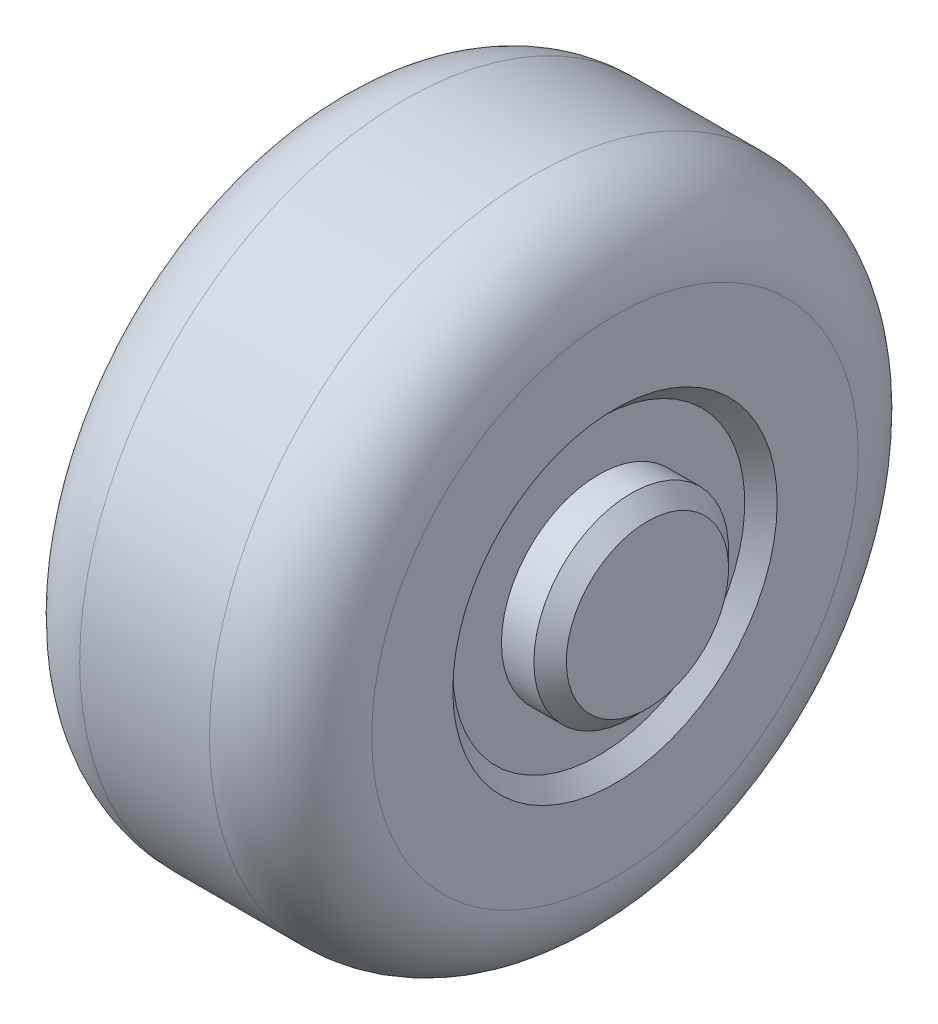
ISO-10303-21;
HEADER;
FILE_DESCRIPTION(('STEP AP214'),'2;1');
FILE_NAME('part.step','',(''),(''),'','','');
FILE_SCHEMA(('AUTOMOTIVE_DESIGN { 1 0 10303 214 1 1 1 1 }'));
ENDSEC;
DATA;
#1=APPLICATION_CONTEXT('core data for automotive mechanical design processes');
#2=APPLICATION_PROTOCOL_DEFINITION('international standard','automotive_design',2000,#1);
#3=PRODUCT_CONTEXT('',#1,'mechanical');
#4=PRODUCT('Part','Part','',(#3));
#5=PRODUCT_RELATED_PRODUCT_CATEGORY('part','',(#4));
#6=PRODUCT_DEFINITION_FORMATION('','',#4);
#7=PRODUCT_DEFINITION_CONTEXT('part definition',#1,'design');
#8=PRODUCT_DEFINITION('design','',#6,#7);
#9=PRODUCT_DEFINITION_SHAPE('','',#8);
#10=(LENGTH_UNIT() NAMED_UNIT(*) SI_UNIT(.MILLI.,.METRE.));
#11=(NAMED_UNIT(*) PLANE_ANGLE_UNIT() SI_UNIT($,.RADIAN.));
#12=(NAMED_UNIT(*) SI_UNIT($,.STERADIAN.) SOLID_ANGLE_UNIT());
#13=UNCERTAINTY_MEASURE_WITH_UNIT(LENGTH_MEASURE(1.E-05),#10,'distance_accuracy_value','');
#14=(GEOMETRIC_REPRESENTATION_CONTEXT(3) GLOBAL_UNCERTAINTY_ASSIGNED_CONTEXT((#13)) GLOBAL_UNIT_ASSIGNED_CONTEXT((#10,
#11,#12)) REPRESENTATION_CONTEXT('',''));
#15=CARTESIAN_POINT('',(0.,0.,0.));
#16=DIRECTION('',(0.,0.,1.));
#17=DIRECTION('',(1.,0.,0.));
#18=AXIS2_PLACEMENT_3D('',#15,#16,#17);
#19=CARTESIAN_POINT('',(-11.,0.,0.));
#20=DIRECTION('',(1.,0.,0.));
#21=DIRECTION('',(0.,0.,-1.));
#22=AXIS2_PLACEMENT_3D('',#19,#20,#21);
#23=PLANE('',#22);
#24=CARTESIAN_POINT('',(-11.,0.,0.));
#25=DIRECTION('',(-1.,0.,0.));
#26=DIRECTION('',(0.,0.,1.));
#27=AXIS2_PLACEMENT_3D('',#24,#25,#26);
#28=CIRCLE('',#27,5.);
#29=CARTESIAN_POINT('',(-11.,0.,5.));
#30=VERTEX_POINT('',#29);
#31=EDGE_CURVE('E10',#30,#30,#28,.T.);
#32=ORIENTED_EDGE('',*,*,#31,.T.);
#33=EDGE_LOOP('',(#32));
#34=FACE_BOUND('',#33,.T.);
#35=ADVANCED_FACE('F37',(#34),#23,.F.);
#36=CARTESIAN_POINT('',(-10.,0.,0.));
#37=DIRECTION('',(1.,0.,0.));
#38=DIRECTION('',(0.,0.,-1.));
#39=AXIS2_PLACEMENT_3D('',#36,#37,#38);
#40=CONICAL_SURFACE('',#39,6.,0.785398163397448);
#41=ORIENTED_EDGE('',*,*,#31,.F.);
#42=EDGE_LOOP('',(#41));
#43=FACE_BOUND('',#42,.T.);
#44=CARTESIAN_POINT('',(-10.,0.,0.));
#45=DIRECTION('',(-1.,0.,0.));
#46=DIRECTION('',(0.,0.,1.));
#47=AXIS2_PLACEMENT_3D('',#44,#45,#46);
#48=CIRCLE('',#47,6.);
#49=CARTESIAN_POINT('',(-10.,0.,6.));
#50=VERTEX_POINT('',#49);
#51=EDGE_CURVE('E43',#50,#50,#48,.T.);
#52=ORIENTED_EDGE('',*,*,#51,.T.);
#53=EDGE_LOOP('',(#52));
#54=FACE_BOUND('',#53,.T.);
#55=ADVANCED_FACE('F99',(#43,#54),#40,.T.);
#56=CARTESIAN_POINT('',(11.,0.,0.));
#57=DIRECTION('',(-1.,0.,0.));
#58=DIRECTION('',(0.,0.,1.));
#59=AXIS2_PLACEMENT_3D('',#56,#57,#58);
#60=CYLINDRICAL_SURFACE('',#59,6.);
#61=ORIENTED_EDGE('',*,*,#51,.F.);
#62=EDGE_LOOP('',(#61));
#63=FACE_BOUND('',#62,.T.);
#64=CARTESIAN_POINT('',(-8.,0.,0.));
#65=DIRECTION('',(-1.,0.,0.));
#66=DIRECTION('',(0.,0.,1.));
#67=AXIS2_PLACEMENT_3D('',#64,#65,#66);
#68=CIRCLE('',#67,6.);
#69=CARTESIAN_POINT('',(-8.,0.,6.));
#70=VERTEX_POINT('',#69);
#71=EDGE_CURVE('E47',#70,#70,#68,.T.);
#72=ORIENTED_EDGE('',*,*,#71,.T.);
#73=EDGE_LOOP('',(#72));
#74=FACE_BOUND('',#73,.T.);
#75=ADVANCED_FACE('F103',(#63,#74),#60,.T.);
#76=CARTESIAN_POINT('',(-8.,6.,0.));
#77=DIRECTION('',(1.,0.,0.));
#78=DIRECTION('',(0.,0.,-1.));
#79=AXIS2_PLACEMENT_3D('',#76,#77,#78);
#80=PLANE('',#79);
#81=ORIENTED_EDGE('',*,*,#71,.F.);
#82=EDGE_LOOP('',(#81));
#83=FACE_BOUND('',#82,.T.);
#84=CARTESIAN_POINT('',(-8.,0.,0.));
#85=DIRECTION('',(-1.,0.,0.));
#86=DIRECTION('',(0.,0.,1.));
#87=AXIS2_PLACEMENT_3D('',#84,#85,#86);
#88=CIRCLE('',#87,9.);
#89=CARTESIAN_POINT('',(-8.,0.,9.));
#90=VERTEX_POINT('',#89);
#91=EDGE_CURVE('E51',#90,#90,#88,.T.);
#92=ORIENTED_EDGE('',*,*,#91,.T.);
#93=EDGE_LOOP('',(#92));
#94=FACE_BOUND('',#93,.T.);
#95=ADVANCED_FACE('F108',(#83,#94),#80,.F.);
#96=CARTESIAN_POINT('',(-9.,0.,0.));
#97=DIRECTION('',(-1.,0.,0.));
#98=DIRECTION('',(0.,0.,1.));
#99=AXIS2_PLACEMENT_3D('',#96,#97,#98);
#100=CONICAL_SURFACE('',#99,10.,0.785398163397447);
#101=ORIENTED_EDGE('',*,*,#91,.F.);
#102=EDGE_LOOP('',(#101));
#103=FACE_BOUND('',#102,.T.);
#104=CARTESIAN_POINT('',(-9.,0.,0.));
#105=DIRECTION('',(-1.,0.,0.));
#106=DIRECTION('',(0.,0.,1.));
#107=AXIS2_PLACEMENT_3D('',#104,#105,#106);
#108=CIRCLE('',#107,10.);
#109=CARTESIAN_POINT('',(-9.,0.,10.));
#110=VERTEX_POINT('',#109);
#111=EDGE_CURVE('E56',#110,#110,#108,.T.);
#112=ORIENTED_EDGE('',*,*,#111,.T.);
#113=EDGE_LOOP('',(#112));
#114=FACE_BOUND('',#113,.T.);
#115=ADVANCED_FACE('F114',(#103,#114),#100,.F.);
#116=CARTESIAN_POINT('',(-9.,10.,0.));
#117=DIRECTION('',(1.,0.,0.));
#118=DIRECTION('',(0.,0.,-1.));
#119=AXIS2_PLACEMENT_3D('',#116,#117,#118);
#120=PLANE('',#119);
#121=ORIENTED_EDGE('',*,*,#111,.F.);
#122=EDGE_LOOP('',(#121));
#123=FACE_BOUND('',#122,.T.);
#124=CARTESIAN_POINT('',(-9.,0.,0.));
#125=DIRECTION('',(-1.,0.,0.));
#126=DIRECTION('',(0.,0.,1.));
#127=AXIS2_PLACEMENT_3D('',#124,#125,#126);
#128=CIRCLE('',#127,15.);
#129=CARTESIAN_POINT('',(-9.,0.,15.));
#130=VERTEX_POINT('',#129);
#131=EDGE_CURVE('E59',#130,#130,#128,.T.);
#132=ORIENTED_EDGE('',*,*,#131,.T.);
#133=EDGE_LOOP('',(#132));
#134=FACE_BOUND('',#133,.T.);
#135=ADVANCED_FACE('F118',(#123,#134),#120,.F.);
#136=CARTESIAN_POINT('',(-4.,0.,0.));
#137=DIRECTION('',(-1.,0.,0.));
#138=DIRECTION('',(0.,0.,1.));
#139=AXIS2_PLACEMENT_3D('',#136,#137,#138);
#140=TOROIDAL_SURFACE('',#139,15.,5.);
#141=ORIENTED_EDGE('',*,*,#131,.F.);
#142=EDGE_LOOP('',(#141));
#143=FACE_BOUND('',#142,.T.);
#144=CARTESIAN_POINT('',(-4.,0.,0.));
#145=DIRECTION('',(-1.,0.,0.));
#146=DIRECTION('',(0.,0.,1.));
#147=AXIS2_PLACEMENT_3D('',#144,#145,#146);
#148=CIRCLE('',#147,20.);
#149=CARTESIAN_POINT('',(-4.,0.,20.));
#150=VERTEX_POINT('',#149);
#151=EDGE_CURVE('E62',#150,#150,#148,.T.);
#152=ORIENTED_EDGE('',*,*,#151,.T.);
#153=EDGE_LOOP('',(#152));
#154=FACE_BOUND('',#153,.T.);
#155=ADVANCED_FACE('F122',(#143,#154),#140,.T.);
#156=CARTESIAN_POINT('',(11.,0.,0.));
#157=DIRECTION('',(-1.,0.,0.));
#158=DIRECTION('',(0.,0.,1.));
#159=AXIS2_PLACEMENT_3D('',#156,#157,#158);
#160=CYLINDRICAL_SURFACE('',#159,20.);
#161=ORIENTED_EDGE('',*,*,#151,.F.);
#162=EDGE_LOOP('',(#161));
#163=FACE_BOUND('',#162,.T.);
#164=CARTESIAN_POINT('',(4.,0.,0.));
#165=DIRECTION('',(-1.,0.,0.));
#166=DIRECTION('',(0.,0.,1.));
#167=AXIS2_PLACEMENT_3D('',#164,#165,#166);
#168=CIRCLE('',#167,20.);
#169=CARTESIAN_POINT('',(4.,0.,20.));
#170=VERTEX_POINT('',#169);
#171=EDGE_CURVE('E65',#170,#170,#168,.T.);
#172=ORIENTED_EDGE('',*,*,#171,.T.);
#173=EDGE_LOOP('',(#172));
#174=FACE_BOUND('',#173,.T.);
#175=ADVANCED_FACE('F126',(#163,#174),#160,.T.);
#176=CARTESIAN_POINT('',(4.,0.,0.));
#177=DIRECTION('',(-1.,0.,0.));
#178=DIRECTION('',(0.,0.,1.));
#179=AXIS2_PLACEMENT_3D('',#176,#177,#178);
#180=TOROIDAL_SURFACE('',#179,15.,5.);
#181=ORIENTED_EDGE('',*,*,#171,.F.);
#182=EDGE_LOOP('',(#181));
#183=FACE_BOUND('',#182,.T.);
#184=CARTESIAN_POINT('',(9.,0.,0.));
#185=DIRECTION('',(-1.,0.,0.));
#186=DIRECTION('',(0.,0.,1.));
#187=AXIS2_PLACEMENT_3D('',#184,#185,#186);
#188=CIRCLE('',#187,15.);
#189=CARTESIAN_POINT('',(9.,0.,15.));
#190=VERTEX_POINT('',#189);
#191=EDGE_CURVE('E68',#190,#190,#188,.T.);
#192=ORIENTED_EDGE('',*,*,#191,.T.);
#193=EDGE_LOOP('',(#192));
#194=FACE_BOUND('',#193,.T.);
#195=ADVANCED_FACE('F130',(#183,#194),#180,.T.);
#196=CARTESIAN_POINT('',(9.,15.,0.));
#197=DIRECTION('',(-1.,0.,0.));
#198=DIRECTION('',(0.,0.,1.));
#199=AXIS2_PLACEMENT_3D('',#196,#197,#198);
#200=PLANE('',#199);
#201=ORIENTED_EDGE('',*,*,#191,.F.);
#202=EDGE_LOOP('',(#201));
#203=FACE_BOUND('',#202,.T.);
#204=CARTESIAN_POINT('',(9.,0.,0.));
#205=DIRECTION('',(-1.,0.,0.));
#206=DIRECTION('',(0.,0.,1.));
#207=AXIS2_PLACEMENT_3D('',#204,#205,#206);
#208=CIRCLE('',#207,10.);
#209=CARTESIAN_POINT('',(9.,0.,10.));
#210=VERTEX_POINT('',#209);
#211=EDGE_CURVE('E71',#210,#210,#208,.T.);
#212=ORIENTED_EDGE('',*,*,#211,.T.);
#213=EDGE_LOOP('',(#212));
#214=FACE_BOUND('',#213,.T.);
#215=ADVANCED_FACE('F134',(#203,#214),#200,.F.);
#216=CARTESIAN_POINT('',(8.,0.,0.));
#217=DIRECTION('',(1.,0.,0.));
#218=DIRECTION('',(0.,0.,-1.));
#219=AXIS2_PLACEMENT_3D('',#216,#217,#218);
#220=CONICAL_SURFACE('',#219,9.,0.785398163397447);
#221=ORIENTED_EDGE('',*,*,#211,.F.);
#222=EDGE_LOOP('',(#221));
#223=FACE_BOUND('',#222,.T.);
#224=CARTESIAN_POINT('',(8.,0.,0.));
#225=DIRECTION('',(-1.,0.,0.));
#226=DIRECTION('',(0.,0.,1.));
#227=AXIS2_PLACEMENT_3D('',#224,#225,#226);
#228=CIRCLE('',#227,9.);
#229=CARTESIAN_POINT('',(8.,0.,9.));
#230=VERTEX_POINT('',#229);
#231=EDGE_CURVE('E74',#230,#230,#228,.T.);
#232=ORIENTED_EDGE('',*,*,#231,.T.);
#233=EDGE_LOOP('',(#232));
#234=FACE_BOUND('',#233,.T.);
#235=ADVANCED_FACE('F138',(#223,#234),#220,.F.);
#236=CARTESIAN_POINT('',(8.,9.,0.));
#237=DIRECTION('',(-1.,0.,0.));
#238=DIRECTION('',(0.,0.,1.));
#239=AXIS2_PLACEMENT_3D('',#236,#237,#238);
#240=PLANE('',#239);
#241=ORIENTED_EDGE('',*,*,#231,.F.);
#242=EDGE_LOOP('',(#241));
#243=FACE_BOUND('',#242,.T.);
#244=CARTESIAN_POINT('',(8.,0.,0.));
#245=DIRECTION('',(-1.,0.,0.));
#246=DIRECTION('',(0.,0.,1.));
#247=AXIS2_PLACEMENT_3D('',#244,#245,#246);
#248=CIRCLE('',#247,6.);
#249=CARTESIAN_POINT('',(8.,0.,6.));
#250=VERTEX_POINT('',#249);
#251=EDGE_CURVE('E77',#250,#250,#248,.T.);
#252=ORIENTED_EDGE('',*,*,#251,.T.);
#253=EDGE_LOOP('',(#252));
#254=FACE_BOUND('',#253,.T.);
#255=ADVANCED_FACE('F142',(#243,#254),#240,.F.);
#256=CARTESIAN_POINT('',(11.,0.,0.));
#257=DIRECTION('',(-1.,0.,0.));
#258=DIRECTION('',(0.,0.,1.));
#259=AXIS2_PLACEMENT_3D('',#256,#257,#258);
#260=CYLINDRICAL_SURFACE('',#259,6.);
#261=ORIENTED_EDGE('',*,*,#251,.F.);
#262=EDGE_LOOP('',(#261));
#263=FACE_BOUND('',#262,.T.);
#264=CARTESIAN_POINT('',(10.,0.,0.));
#265=DIRECTION('',(-1.,0.,0.));
#266=DIRECTION('',(0.,0.,1.));
#267=AXIS2_PLACEMENT_3D('',#264,#265,#266);
#268=CIRCLE('',#267,6.);
#269=CARTESIAN_POINT('',(10.,0.,6.));
#270=VERTEX_POINT('',#269);
#271=EDGE_CURVE('E80',#270,#270,#268,.T.);
#272=ORIENTED_EDGE('',*,*,#271,.T.);
#273=EDGE_LOOP('',(#272));
#274=FACE_BOUND('',#273,.T.);
#275=ADVANCED_FACE('F95',(#263,#274),#260,.T.);
#276=CARTESIAN_POINT('',(11.,0.,0.));
#277=DIRECTION('',(-1.,0.,0.));
#278=DIRECTION('',(0.,0.,1.));
#279=AXIS2_PLACEMENT_3D('',#276,#277,#278);
#280=CONICAL_SURFACE('',#279,5.,0.785398163397449);
#281=ORIENTED_EDGE('',*,*,#271,.F.);
#282=EDGE_LOOP('',(#281));
#283=FACE_BOUND('',#282,.T.);
#284=CARTESIAN_POINT('',(11.,0.,0.));
#285=DIRECTION('',(-1.,0.,0.));
#286=DIRECTION('',(0.,0.,1.));
#287=AXIS2_PLACEMENT_3D('',#284,#285,#286);
#288=CIRCLE('',#287,5.);
#289=CARTESIAN_POINT('',(11.,0.,5.));
#290=VERTEX_POINT('',#289);
#291=EDGE_CURVE('E83',#290,#290,#288,.T.);
#292=ORIENTED_EDGE('',*,*,#291,.T.);
#293=EDGE_LOOP('',(#292));
#294=FACE_BOUND('',#293,.T.);
#295=ADVANCED_FACE('F87',(#283,#294),#280,.T.);
#296=CARTESIAN_POINT('',(11.,5.,0.));
#297=DIRECTION('',(-1.,0.,0.));
#298=DIRECTION('',(0.,0.,1.));
#299=AXIS2_PLACEMENT_3D('',#296,#297,#298);
#300=PLANE('',#299);
#301=ORIENTED_EDGE('',*,*,#291,.F.);
#302=EDGE_LOOP('',(#301));
#303=FACE_BOUND('',#302,.T.);
#304=ADVANCED_FACE('F89',(#303),#300,.F.);
#305=CLOSED_SHELL('',(#35,#55,#75,#95,#115,#135,#155,#175,#195,#215,#235,#255,#275,#295,#304));
#306=MANIFOLD_SOLID_BREP('B2',#305);
#307=ADVANCED_BREP_SHAPE_REPRESENTATION('',(#18,#306),#14);
#308=SHAPE_DEFINITION_REPRESENTATION(#9,#307);
ENDSEC;
END-ISO-10303-21;
